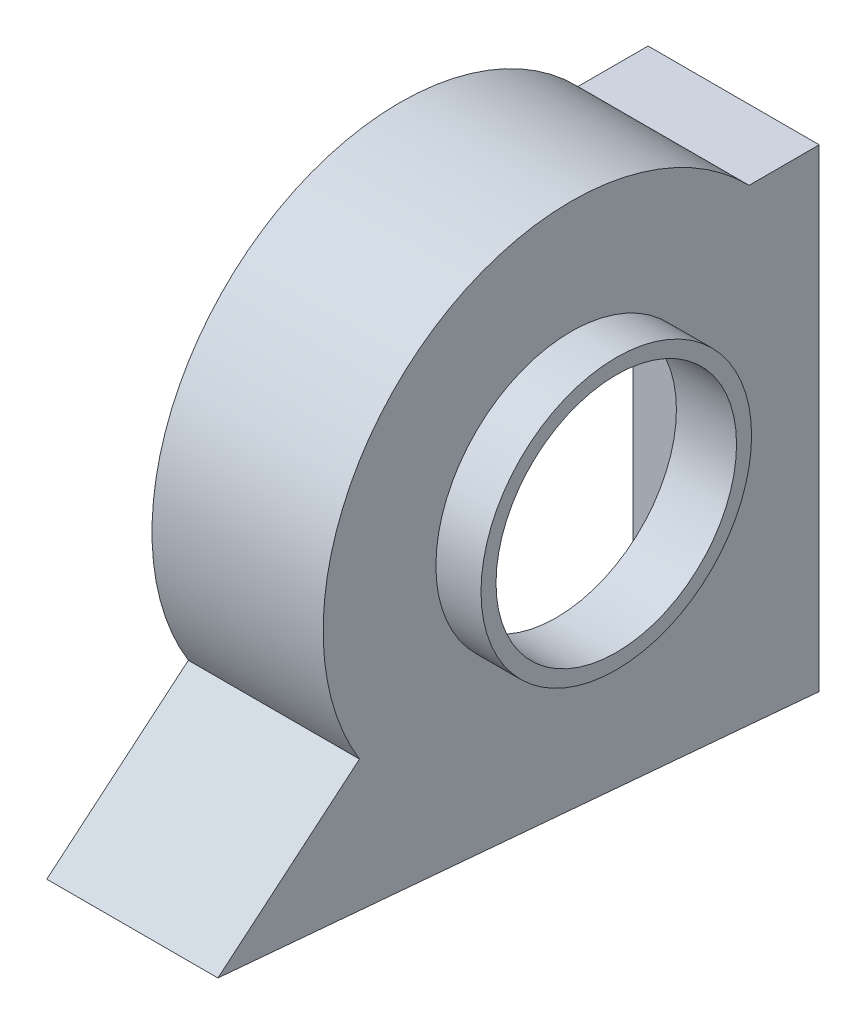
ISO-10303-21;
HEADER;
FILE_DESCRIPTION(('STEP AP214'),'2;1');
FILE_NAME('part.step','',(''),(''),'','','');
FILE_SCHEMA(('AUTOMOTIVE_DESIGN { 1 0 10303 214 1 1 1 1 }'));
ENDSEC;
DATA;
#1=APPLICATION_CONTEXT('core data for automotive mechanical design processes');
#2=APPLICATION_PROTOCOL_DEFINITION('international standard','automotive_design',2000,#1);
#3=PRODUCT_CONTEXT('',#1,'mechanical');
#4=PRODUCT('Part','Part','',(#3));
#5=PRODUCT_RELATED_PRODUCT_CATEGORY('part','',(#4));
#6=PRODUCT_DEFINITION_FORMATION('','',#4);
#7=PRODUCT_DEFINITION_CONTEXT('part definition',#1,'design');
#8=PRODUCT_DEFINITION('design','',#6,#7);
#9=PRODUCT_DEFINITION_SHAPE('','',#8);
#10=(LENGTH_UNIT() NAMED_UNIT(*) SI_UNIT(.MILLI.,.METRE.));
#11=(NAMED_UNIT(*) PLANE_ANGLE_UNIT() SI_UNIT($,.RADIAN.));
#12=(NAMED_UNIT(*) SI_UNIT($,.STERADIAN.) SOLID_ANGLE_UNIT());
#13=UNCERTAINTY_MEASURE_WITH_UNIT(LENGTH_MEASURE(1.E-05),#10,'distance_accuracy_value','');
#14=(GEOMETRIC_REPRESENTATION_CONTEXT(3) GLOBAL_UNCERTAINTY_ASSIGNED_CONTEXT((#13)) GLOBAL_UNIT_ASSIGNED_CONTEXT((#10,
#11,#12)) REPRESENTATION_CONTEXT('',''));
#15=CARTESIAN_POINT('',(0.,0.,0.));
#16=DIRECTION('',(0.,0.,1.));
#17=DIRECTION('',(1.,0.,0.));
#18=AXIS2_PLACEMENT_3D('',#15,#16,#17);
#19=CARTESIAN_POINT('',(-5.6925,35.,20.));
#20=DIRECTION('',(1.,0.,0.));
#21=DIRECTION('',(0.,0.,-1.));
#22=AXIS2_PLACEMENT_3D('',#19,#20,#21);
#23=PLANE('',#22);
#24=DIRECTION('',(0.,-1.,0.));
#25=VECTOR('',#24,1.);
#26=CARTESIAN_POINT('',(-5.6925,35.,-19.));
#27=LINE('',#26,#25);
#28=CARTESIAN_POINT('',(-5.6925,13.5,-19.));
#29=VERTEX_POINT('',#28);
#30=CARTESIAN_POINT('',(-5.6925,-2.40823803996742,-19.));
#31=VERTEX_POINT('',#30);
#32=EDGE_CURVE('E216',#29,#31,#27,.T.);
#33=ORIENTED_EDGE('',*,*,#32,.F.);
#34=DIRECTION('',(0.,0.,-1.));
#35=VECTOR('',#34,1.);
#36=CARTESIAN_POINT('',(-5.6925,13.5,-13.));
#37=LINE('',#36,#35);
#38=CARTESIAN_POINT('',(-5.6925,13.5,-20.));
#39=VERTEX_POINT('',#38);
#40=EDGE_CURVE('E54',#29,#39,#37,.T.);
#41=ORIENTED_EDGE('',*,*,#40,.T.);
#42=DIRECTION('',(0.,-1.,0.));
#43=VECTOR('',#42,1.);
#44=CARTESIAN_POINT('',(-5.6925,35.,-20.));
#45=LINE('',#44,#43);
#46=CARTESIAN_POINT('',(-5.6925,-3.49954654103668,-20.));
#47=VERTEX_POINT('',#46);
#48=EDGE_CURVE('E143',#39,#47,#45,.T.);
#49=ORIENTED_EDGE('',*,*,#48,.T.);
#50=DIRECTION('',(0.,0.0871557427476513,0.996194698091746));
#51=VECTOR('',#50,1.);
#52=CARTESIAN_POINT('',(-5.6925,0.,20.));
#53=LINE('',#52,#51);
#54=CARTESIAN_POINT('',(-5.6925,0.,20.));
#55=VERTEX_POINT('',#54);
#56=EDGE_CURVE('E231',#47,#55,#53,.T.);
#57=ORIENTED_EDGE('',*,*,#56,.T.);
#58=DIRECTION('',(0.,-0.642787609686538,0.766044443118979));
#59=VECTOR('',#58,1.);
#60=CARTESIAN_POINT('',(-5.6925,9.84807753012207,8.26351822333066));
#61=LINE('',#60,#59);
#62=CARTESIAN_POINT('',(-5.6925,7.90199647080288,10.5827673172539));
#63=VERTEX_POINT('',#62);
#64=EDGE_CURVE('E251',#63,#55,#61,.T.);
#65=ORIENTED_EDGE('',*,*,#64,.F.);
#66=CARTESIAN_POINT('',(-5.6925,16.5,-3.5));
#67=DIRECTION('',(1.,0.,0.));
#68=DIRECTION('',(0.,0.,-1.));
#69=AXIS2_PLACEMENT_3D('',#66,#67,#68);
#70=CIRCLE('',#69,16.5);
#71=CARTESIAN_POINT('',(-5.6925,28.,-15.3321595661992));
#72=VERTEX_POINT('',#71);
#73=EDGE_CURVE('E245',#72,#63,#70,.T.);
#74=ORIENTED_EDGE('',*,*,#73,.F.);
#75=DIRECTION('',(0.,0.,-1.));
#76=VECTOR('',#75,1.);
#77=CARTESIAN_POINT('',(-5.6925,28.,0.));
#78=LINE('',#77,#76);
#79=CARTESIAN_POINT('',(-5.6925,28.,-20.));
#80=VERTEX_POINT('',#79);
#81=EDGE_CURVE('E150',#72,#80,#78,.T.);
#82=ORIENTED_EDGE('',*,*,#81,.T.);
#83=CARTESIAN_POINT('',(-5.6925,19.5,-20.));
#84=VERTEX_POINT('',#83);
#85=EDGE_CURVE('E141',#80,#84,#45,.T.);
#86=ORIENTED_EDGE('',*,*,#85,.T.);
#87=DIRECTION('',(0.,0.,-1.));
#88=VECTOR('',#87,1.);
#89=CARTESIAN_POINT('',(-5.6925,19.5,-13.));
#90=LINE('',#89,#88);
#91=CARTESIAN_POINT('',(-5.6925,19.5,-19.));
#92=VERTEX_POINT('',#91);
#93=EDGE_CURVE('E126',#84,#92,#90,.F.);
#94=ORIENTED_EDGE('',*,*,#93,.T.);
#95=CARTESIAN_POINT('',(-5.6925,27.,-19.));
#96=VERTEX_POINT('',#95);
#97=EDGE_CURVE('E190',#96,#92,#27,.T.);
#98=ORIENTED_EDGE('',*,*,#97,.F.);
#99=DIRECTION('',(0.,0.,-1.));
#100=VECTOR('',#99,1.);
#101=CARTESIAN_POINT('',(-5.6925,27.,20.));
#102=LINE('',#101,#100);
#103=CARTESIAN_POINT('',(-5.6925,27.,-14.9017542509914));
#104=VERTEX_POINT('',#103);
#105=EDGE_CURVE('E225',#104,#96,#102,.T.);
#106=ORIENTED_EDGE('',*,*,#105,.F.);
#107=CARTESIAN_POINT('',(-5.6925,16.5,-3.5));
#108=DIRECTION('',(1.,0.,0.));
#109=DIRECTION('',(0.,0.,-1.));
#110=AXIS2_PLACEMENT_3D('',#107,#108,#109);
#111=CIRCLE('',#110,15.5);
#112=CARTESIAN_POINT('',(-5.6925,7.70429056918022,9.26266020892933));
#113=VERTEX_POINT('',#112);
#114=EDGE_CURVE('E62',#104,#113,#111,.T.);
#115=ORIENTED_EDGE('',*,*,#114,.T.);
#116=DIRECTION('',(0.,-0.642787609686538,0.766044443118979));
#117=VECTOR('',#116,1.);
#118=CARTESIAN_POINT('',(-5.6925,13.6951124477097,2.12307671259983));
#119=LINE('',#118,#117);
#120=CARTESIAN_POINT('',(-5.6925,0.785782121911663,17.5078175063551));
#121=VERTEX_POINT('',#120);
#122=EDGE_CURVE('E208',#113,#121,#119,.T.);
#123=ORIENTED_EDGE('',*,*,#122,.T.);
#124=DIRECTION('',(0.,0.0871557427476514,0.996194698091746));
#125=VECTOR('',#124,1.);
#126=CARTESIAN_POINT('',(-5.6925,1.26205902037806,22.9516873664234));
#127=LINE('',#126,#125);
#128=EDGE_CURVE('E172',#31,#121,#127,.T.);
#129=ORIENTED_EDGE('',*,*,#128,.F.);
#130=EDGE_LOOP('',(#33,#41,#49,#57,#65,#74,#82,#86,#94,#98,#106,#115,#123,#129));
#131=FACE_BOUND('',#130,.T.);
#132=ADVANCED_FACE('F39',(#131),#23,.F.);
#133=CARTESIAN_POINT('',(5.6925,35.,20.));
#134=DIRECTION('',(-1.,0.,0.));
#135=DIRECTION('',(0.,0.,1.));
#136=AXIS2_PLACEMENT_3D('',#133,#134,#135);
#137=PLANE('',#136);
#138=CARTESIAN_POINT('',(5.6925,16.5,-3.5));
#139=DIRECTION('',(-1.,0.,0.));
#140=DIRECTION('',(0.,0.,1.));
#141=AXIS2_PLACEMENT_3D('',#138,#139,#140);
#142=CIRCLE('',#141,9.00000000000001);
#143=CARTESIAN_POINT('',(5.6925,16.5,5.50000000000001));
#144=VERTEX_POINT('',#143);
#145=EDGE_CURVE('E48',#144,#144,#142,.F.);
#146=ORIENTED_EDGE('',*,*,#145,.F.);
#147=EDGE_LOOP('',(#146));
#148=FACE_BOUND('',#147,.T.);
#149=DIRECTION('',(0.,-0.642787609686538,0.766044443118979));
#150=VECTOR('',#149,1.);
#151=CARTESIAN_POINT('',(5.6925,9.84807753012207,8.26351822333066));
#152=LINE('',#151,#150);
#153=CARTESIAN_POINT('',(5.6925,7.90199647080288,10.5827673172539));
#154=VERTEX_POINT('',#153);
#155=CARTESIAN_POINT('',(5.6925,0.,20.));
#156=VERTEX_POINT('',#155);
#157=EDGE_CURVE('E248',#154,#156,#152,.T.);
#158=ORIENTED_EDGE('',*,*,#157,.T.);
#159=DIRECTION('',(0.,0.0871557427476513,0.996194698091746));
#160=VECTOR('',#159,1.);
#161=CARTESIAN_POINT('',(5.6925,0.,20.));
#162=LINE('',#161,#160);
#163=CARTESIAN_POINT('',(5.6925,-3.49954654103668,-20.));
#164=VERTEX_POINT('',#163);
#165=EDGE_CURVE('E180',#164,#156,#162,.T.);
#166=ORIENTED_EDGE('',*,*,#165,.F.);
#167=DIRECTION('',(0.,-1.,0.));
#168=VECTOR('',#167,1.);
#169=CARTESIAN_POINT('',(5.6925,35.,-20.));
#170=LINE('',#169,#168);
#171=CARTESIAN_POINT('',(5.6925,28.,-20.));
#172=VERTEX_POINT('',#171);
#173=EDGE_CURVE('E152',#172,#164,#170,.T.);
#174=ORIENTED_EDGE('',*,*,#173,.F.);
#175=DIRECTION('',(0.,0.,-1.));
#176=VECTOR('',#175,1.);
#177=CARTESIAN_POINT('',(5.6925,28.,0.));
#178=LINE('',#177,#176);
#179=CARTESIAN_POINT('',(5.6925,28.,-15.3321595661992));
#180=VERTEX_POINT('',#179);
#181=EDGE_CURVE('E259',#180,#172,#178,.T.);
#182=ORIENTED_EDGE('',*,*,#181,.F.);
#183=CARTESIAN_POINT('',(5.6925,16.5,-3.5));
#184=DIRECTION('',(1.,0.,0.));
#185=DIRECTION('',(0.,0.,-1.));
#186=AXIS2_PLACEMENT_3D('',#183,#184,#185);
#187=CIRCLE('',#186,16.5);
#188=EDGE_CURVE('E244',#180,#154,#187,.T.);
#189=ORIENTED_EDGE('',*,*,#188,.T.);
#190=EDGE_LOOP('',(#158,#166,#174,#182,#189));
#191=FACE_BOUND('',#190,.T.);
#192=ADVANCED_FACE('F41',(#148,#191),#137,.F.);
#193=CARTESIAN_POINT('',(-5.6925,35.,-20.));
#194=DIRECTION('',(0.,0.,1.));
#195=DIRECTION('',(1.,0.,0.));
#196=AXIS2_PLACEMENT_3D('',#193,#194,#195);
#197=PLANE('',#196);
#198=ORIENTED_EDGE('',*,*,#48,.F.);
#199=CARTESIAN_POINT('',(-5.6925,16.5,-20.));
#200=DIRECTION('',(0.,0.,-1.));
#201=DIRECTION('',(-1.,0.,0.));
#202=AXIS2_PLACEMENT_3D('',#199,#200,#201);
#203=CIRCLE('',#202,3.);
#204=EDGE_CURVE('E129',#84,#39,#203,.T.);
#205=ORIENTED_EDGE('',*,*,#204,.F.);
#206=ORIENTED_EDGE('',*,*,#85,.F.);
#207=DIRECTION('',(1.,0.,0.));
#208=VECTOR('',#207,1.);
#209=CARTESIAN_POINT('',(-5.6925,28.,-20.));
#210=LINE('',#209,#208);
#211=EDGE_CURVE('E269',#80,#172,#210,.T.);
#212=ORIENTED_EDGE('',*,*,#211,.T.);
#213=ORIENTED_EDGE('',*,*,#173,.T.);
#214=DIRECTION('',(1.,0.,0.));
#215=VECTOR('',#214,1.);
#216=CARTESIAN_POINT('',(-5.6925,-3.49954654103668,-20.));
#217=LINE('',#216,#215);
#218=EDGE_CURVE('E235',#47,#164,#217,.T.);
#219=ORIENTED_EDGE('',*,*,#218,.F.);
#220=EDGE_LOOP('',(#198,#205,#206,#212,#213,#219));
#221=FACE_BOUND('',#220,.T.);
#222=ADVANCED_FACE('F139',(#221),#197,.F.);
#223=CARTESIAN_POINT('',(-5.6925,16.5,-3.5));
#224=DIRECTION('',(1.,0.,0.));
#225=DIRECTION('',(0.,0.,-1.));
#226=AXIS2_PLACEMENT_3D('',#223,#224,#225);
#227=CYLINDRICAL_SURFACE('',#226,16.5);
#228=ORIENTED_EDGE('',*,*,#188,.F.);
#229=DIRECTION('',(1.,0.,0.));
#230=VECTOR('',#229,1.);
#231=CARTESIAN_POINT('',(-5.6925,28.,-15.3321595661992));
#232=LINE('',#231,#230);
#233=EDGE_CURVE('E255',#72,#180,#232,.T.);
#234=ORIENTED_EDGE('',*,*,#233,.F.);
#235=ORIENTED_EDGE('',*,*,#73,.T.);
#236=DIRECTION('',(1.,0.,0.));
#237=VECTOR('',#236,1.);
#238=CARTESIAN_POINT('',(-5.6925,7.90199647080288,10.5827673172539));
#239=LINE('',#238,#237);
#240=EDGE_CURVE('E265',#63,#154,#239,.T.);
#241=ORIENTED_EDGE('',*,*,#240,.T.);
#242=EDGE_LOOP('',(#228,#234,#235,#241));
#243=FACE_BOUND('',#242,.T.);
#244=ADVANCED_FACE('F277',(#243),#227,.T.);
#245=CARTESIAN_POINT('',(-5.6925,9.84807753012207,8.26351822333066));
#246=DIRECTION('',(0.,0.766044443118979,0.642787609686538));
#247=DIRECTION('',(0.,-0.642787609686538,0.766044443118979));
#248=AXIS2_PLACEMENT_3D('',#245,#246,#247);
#249=PLANE('',#248);
#250=ORIENTED_EDGE('',*,*,#157,.F.);
#251=ORIENTED_EDGE('',*,*,#240,.F.);
#252=ORIENTED_EDGE('',*,*,#64,.T.);
#253=DIRECTION('',(1.,0.,0.));
#254=VECTOR('',#253,1.);
#255=CARTESIAN_POINT('',(-5.6925,0.,20.));
#256=LINE('',#255,#254);
#257=EDGE_CURVE('E158',#55,#156,#256,.T.);
#258=ORIENTED_EDGE('',*,*,#257,.T.);
#259=EDGE_LOOP('',(#250,#251,#252,#258));
#260=FACE_BOUND('',#259,.T.);
#261=ADVANCED_FACE('F288',(#260),#249,.T.);
#262=CARTESIAN_POINT('',(-5.6925,28.,0.));
#263=DIRECTION('',(0.,-1.,0.));
#264=DIRECTION('',(0.,0.,-1.));
#265=AXIS2_PLACEMENT_3D('',#262,#263,#264);
#266=PLANE('',#265);
#267=ORIENTED_EDGE('',*,*,#181,.T.);
#268=ORIENTED_EDGE('',*,*,#211,.F.);
#269=ORIENTED_EDGE('',*,*,#81,.F.);
#270=ORIENTED_EDGE('',*,*,#233,.T.);
#271=EDGE_LOOP('',(#267,#268,#269,#270));
#272=FACE_BOUND('',#271,.T.);
#273=ADVANCED_FACE('F274',(#272),#266,.F.);
#274=CARTESIAN_POINT('',(8.6925,16.5,-3.5));
#275=DIRECTION('',(-1.,0.,0.));
#276=DIRECTION('',(0.,0.,1.));
#277=AXIS2_PLACEMENT_3D('',#274,#275,#276);
#278=CYLINDRICAL_SURFACE('',#277,9.00000000000001);
#279=CARTESIAN_POINT('',(8.6925,16.5,-3.5));
#280=DIRECTION('',(1.,0.,0.));
#281=DIRECTION('',(0.,0.,-1.));
#282=AXIS2_PLACEMENT_3D('',#279,#280,#281);
#283=CIRCLE('',#282,9.00000000000001);
#284=CARTESIAN_POINT('',(8.6925,16.5,-12.5));
#285=VERTEX_POINT('',#284);
#286=EDGE_CURVE('E240',#285,#285,#283,.T.);
#287=ORIENTED_EDGE('',*,*,#286,.F.);
#288=EDGE_LOOP('',(#287));
#289=FACE_BOUND('',#288,.T.);
#290=ORIENTED_EDGE('',*,*,#145,.T.);
#291=EDGE_LOOP('',(#290));
#292=FACE_BOUND('',#291,.T.);
#293=ADVANCED_FACE('F296',(#289,#292),#278,.T.);
#294=CARTESIAN_POINT('',(8.6925,16.5,-3.5));
#295=DIRECTION('',(1.,0.,0.));
#296=DIRECTION('',(0.,0.,-1.));
#297=AXIS2_PLACEMENT_3D('',#294,#295,#296);
#298=PLANE('',#297);
#299=CARTESIAN_POINT('',(8.6925,16.5,-3.5));
#300=DIRECTION('',(1.,0.,0.));
#301=DIRECTION('',(0.,0.,-1.));
#302=AXIS2_PLACEMENT_3D('',#299,#300,#301);
#303=CIRCLE('',#302,8.);
#304=CARTESIAN_POINT('',(8.6925,16.5,-11.5));
#305=VERTEX_POINT('',#304);
#306=EDGE_CURVE('E164',#305,#305,#303,.T.);
#307=ORIENTED_EDGE('',*,*,#306,.F.);
#308=EDGE_LOOP('',(#307));
#309=FACE_BOUND('',#308,.T.);
#310=ORIENTED_EDGE('',*,*,#286,.T.);
#311=EDGE_LOOP('',(#310));
#312=FACE_BOUND('',#311,.T.);
#313=ADVANCED_FACE('F332',(#309,#312),#298,.T.);
#314=CARTESIAN_POINT('',(-5.6925,0.,20.));
#315=DIRECTION('',(0.,0.996194698091746,-0.0871557427476514));
#316=DIRECTION('',(0.,0.0871557427476514,0.996194698091746));
#317=AXIS2_PLACEMENT_3D('',#314,#315,#316);
#318=PLANE('',#317);
#319=ORIENTED_EDGE('',*,*,#165,.T.);
#320=ORIENTED_EDGE('',*,*,#257,.F.);
#321=ORIENTED_EDGE('',*,*,#56,.F.);
#322=ORIENTED_EDGE('',*,*,#218,.T.);
#323=EDGE_LOOP('',(#319,#320,#321,#322));
#324=FACE_BOUND('',#323,.T.);
#325=ADVANCED_FACE('F284',(#324),#318,.F.);
#326=CARTESIAN_POINT('',(4.6925,35.,20.));
#327=DIRECTION('',(-1.,0.,0.));
#328=DIRECTION('',(0.,0.,1.));
#329=AXIS2_PLACEMENT_3D('',#326,#327,#328);
#330=PLANE('',#329);
#331=CARTESIAN_POINT('',(4.6925,16.5,-3.5));
#332=DIRECTION('',(-1.,0.,0.));
#333=DIRECTION('',(0.,0.,1.));
#334=AXIS2_PLACEMENT_3D('',#331,#332,#333);
#335=CIRCLE('',#334,8.);
#336=CARTESIAN_POINT('',(4.6925,16.5,4.5));
#337=VERTEX_POINT('',#336);
#338=EDGE_CURVE('E176',#337,#337,#335,.F.);
#339=ORIENTED_EDGE('',*,*,#338,.T.);
#340=EDGE_LOOP('',(#339));
#341=FACE_BOUND('',#340,.T.);
#342=DIRECTION('',(0.,-0.642787609686538,0.766044443118979));
#343=VECTOR('',#342,1.);
#344=CARTESIAN_POINT('',(4.6925,9.0820330870031,7.62073061364412));
#345=LINE('',#344,#343);
#346=CARTESIAN_POINT('',(4.6925,7.70429056918022,9.26266020892933));
#347=VERTEX_POINT('',#346);
#348=CARTESIAN_POINT('',(4.6925,0.785782121911663,17.5078175063551));
#349=VERTEX_POINT('',#348);
#350=EDGE_CURVE('E182',#347,#349,#345,.T.);
#351=ORIENTED_EDGE('',*,*,#350,.F.);
#352=CARTESIAN_POINT('',(4.6925,16.5,-3.5));
#353=DIRECTION('',(-1.,0.,0.));
#354=DIRECTION('',(0.,0.,1.));
#355=AXIS2_PLACEMENT_3D('',#352,#353,#354);
#356=CIRCLE('',#355,15.5);
#357=CARTESIAN_POINT('',(4.6925,27.,-14.9017542509914));
#358=VERTEX_POINT('',#357);
#359=EDGE_CURVE('E193',#358,#347,#356,.F.);
#360=ORIENTED_EDGE('',*,*,#359,.F.);
#361=DIRECTION('',(0.,0.,-1.));
#362=VECTOR('',#361,1.);
#363=CARTESIAN_POINT('',(4.6925,27.,0.));
#364=LINE('',#363,#362);
#365=CARTESIAN_POINT('',(4.6925,27.,-19.));
#366=VERTEX_POINT('',#365);
#367=EDGE_CURVE('E185',#358,#366,#364,.T.);
#368=ORIENTED_EDGE('',*,*,#367,.T.);
#369=DIRECTION('',(0.,-1.,0.));
#370=VECTOR('',#369,1.);
#371=CARTESIAN_POINT('',(4.6925,35.,-19.));
#372=LINE('',#371,#370);
#373=CARTESIAN_POINT('',(4.6925,-2.40823803996742,-19.));
#374=VERTEX_POINT('',#373);
#375=EDGE_CURVE('E181',#366,#374,#372,.T.);
#376=ORIENTED_EDGE('',*,*,#375,.T.);
#377=DIRECTION('',(0.,0.0871557427476514,0.996194698091746));
#378=VECTOR('',#377,1.);
#379=CARTESIAN_POINT('',(4.6925,0.996194698091746,19.9128442572523));
#380=LINE('',#379,#378);
#381=EDGE_CURVE('E167',#374,#349,#380,.T.);
#382=ORIENTED_EDGE('',*,*,#381,.T.);
#383=EDGE_LOOP('',(#351,#360,#368,#376,#382));
#384=FACE_BOUND('',#383,.T.);
#385=ADVANCED_FACE('F351',(#341,#384),#330,.T.);
#386=CARTESIAN_POINT('',(-5.6925,35.,-19.));
#387=DIRECTION('',(0.,0.,1.));
#388=DIRECTION('',(1.,0.,0.));
#389=AXIS2_PLACEMENT_3D('',#386,#387,#388);
#390=PLANE('',#389);
#391=CARTESIAN_POINT('',(-5.6925,16.5,-19.));
#392=DIRECTION('',(0.,0.,1.));
#393=DIRECTION('',(1.,0.,0.));
#394=AXIS2_PLACEMENT_3D('',#391,#392,#393);
#395=CIRCLE('',#394,3.);
#396=EDGE_CURVE('E11',#29,#92,#395,.T.);
#397=ORIENTED_EDGE('',*,*,#396,.F.);
#398=ORIENTED_EDGE('',*,*,#32,.T.);
#399=DIRECTION('',(1.,0.,0.));
#400=VECTOR('',#399,1.);
#401=CARTESIAN_POINT('',(-5.6925,-2.40823803996742,-19.));
#402=LINE('',#401,#400);
#403=EDGE_CURVE('E197',#31,#374,#402,.T.);
#404=ORIENTED_EDGE('',*,*,#403,.T.);
#405=ORIENTED_EDGE('',*,*,#375,.F.);
#406=DIRECTION('',(1.,0.,0.));
#407=VECTOR('',#406,1.);
#408=CARTESIAN_POINT('',(-5.6925,27.,-19.));
#409=LINE('',#408,#407);
#410=EDGE_CURVE('E200',#96,#366,#409,.T.);
#411=ORIENTED_EDGE('',*,*,#410,.F.);
#412=ORIENTED_EDGE('',*,*,#97,.T.);
#413=EDGE_LOOP('',(#397,#398,#404,#405,#411,#412));
#414=FACE_BOUND('',#413,.T.);
#415=ADVANCED_FACE('F361',(#414),#390,.T.);
#416=CARTESIAN_POINT('',(-5.6925,16.5,-3.5));
#417=DIRECTION('',(1.,0.,0.));
#418=DIRECTION('',(0.,0.,-1.));
#419=AXIS2_PLACEMENT_3D('',#416,#417,#418);
#420=CYLINDRICAL_SURFACE('',#419,15.5);
#421=ORIENTED_EDGE('',*,*,#359,.T.);
#422=DIRECTION('',(1.,0.,0.));
#423=VECTOR('',#422,1.);
#424=CARTESIAN_POINT('',(-5.6925,7.70429056918022,9.26266020892933));
#425=LINE('',#424,#423);
#426=EDGE_CURVE('E204',#113,#347,#425,.T.);
#427=ORIENTED_EDGE('',*,*,#426,.F.);
#428=ORIENTED_EDGE('',*,*,#114,.F.);
#429=DIRECTION('',(1.,0.,0.));
#430=VECTOR('',#429,1.);
#431=CARTESIAN_POINT('',(-5.6925,27.,-14.9017542509914));
#432=LINE('',#431,#430);
#433=EDGE_CURVE('E205',#104,#358,#432,.T.);
#434=ORIENTED_EDGE('',*,*,#433,.T.);
#435=EDGE_LOOP('',(#421,#427,#428,#434));
#436=FACE_BOUND('',#435,.T.);
#437=ADVANCED_FACE('F370',(#436),#420,.F.);
#438=CARTESIAN_POINT('',(-5.6925,9.0820330870031,7.62073061364412));
#439=DIRECTION('',(0.,0.766044443118979,0.642787609686538));
#440=DIRECTION('',(0.,-0.642787609686538,0.766044443118979));
#441=AXIS2_PLACEMENT_3D('',#438,#439,#440);
#442=PLANE('',#441);
#443=ORIENTED_EDGE('',*,*,#350,.T.);
#444=DIRECTION('',(1.,0.,0.));
#445=VECTOR('',#444,1.);
#446=CARTESIAN_POINT('',(-5.6925,0.785782121911663,17.5078175063551));
#447=LINE('',#446,#445);
#448=EDGE_CURVE('E212',#121,#349,#447,.T.);
#449=ORIENTED_EDGE('',*,*,#448,.F.);
#450=ORIENTED_EDGE('',*,*,#122,.F.);
#451=ORIENTED_EDGE('',*,*,#426,.T.);
#452=EDGE_LOOP('',(#443,#449,#450,#451));
#453=FACE_BOUND('',#452,.T.);
#454=ADVANCED_FACE('F375',(#453),#442,.F.);
#455=CARTESIAN_POINT('',(-5.6925,27.,0.));
#456=DIRECTION('',(0.,-1.,0.));
#457=DIRECTION('',(0.,0.,-1.));
#458=AXIS2_PLACEMENT_3D('',#455,#456,#457);
#459=PLANE('',#458);
#460=ORIENTED_EDGE('',*,*,#367,.F.);
#461=ORIENTED_EDGE('',*,*,#433,.F.);
#462=ORIENTED_EDGE('',*,*,#105,.T.);
#463=ORIENTED_EDGE('',*,*,#410,.T.);
#464=EDGE_LOOP('',(#460,#461,#462,#463));
#465=FACE_BOUND('',#464,.T.);
#466=ADVANCED_FACE('F385',(#465),#459,.T.);
#467=CARTESIAN_POINT('',(8.6925,16.5,-3.5));
#468=DIRECTION('',(-1.,0.,0.));
#469=DIRECTION('',(0.,0.,1.));
#470=AXIS2_PLACEMENT_3D('',#467,#468,#469);
#471=CYLINDRICAL_SURFACE('',#470,8.);
#472=ORIENTED_EDGE('',*,*,#338,.F.);
#473=EDGE_LOOP('',(#472));
#474=FACE_BOUND('',#473,.T.);
#475=ORIENTED_EDGE('',*,*,#306,.T.);
#476=EDGE_LOOP('',(#475));
#477=FACE_BOUND('',#476,.T.);
#478=ADVANCED_FACE('F395',(#474,#477),#471,.F.);
#479=CARTESIAN_POINT('',(-5.6925,0.996194698091746,19.9128442572523));
#480=DIRECTION('',(0.,0.996194698091746,-0.0871557427476514));
#481=DIRECTION('',(0.,0.0871557427476514,0.996194698091746));
#482=AXIS2_PLACEMENT_3D('',#479,#480,#481);
#483=PLANE('',#482);
#484=ORIENTED_EDGE('',*,*,#381,.F.);
#485=ORIENTED_EDGE('',*,*,#403,.F.);
#486=ORIENTED_EDGE('',*,*,#128,.T.);
#487=ORIENTED_EDGE('',*,*,#448,.T.);
#488=EDGE_LOOP('',(#484,#485,#486,#487));
#489=FACE_BOUND('',#488,.T.);
#490=ADVANCED_FACE('F403',(#489),#483,.T.);
#491=CARTESIAN_POINT('',(-5.6925,16.5,-13.));
#492=DIRECTION('',(0.,0.,-1.));
#493=DIRECTION('',(-1.,0.,0.));
#494=AXIS2_PLACEMENT_3D('',#491,#492,#493);
#495=CYLINDRICAL_SURFACE('',#494,3.);
#496=ORIENTED_EDGE('',*,*,#396,.T.);
#497=ORIENTED_EDGE('',*,*,#93,.F.);
#498=ORIENTED_EDGE('',*,*,#204,.T.);
#499=ORIENTED_EDGE('',*,*,#40,.F.);
#500=EDGE_LOOP('',(#496,#497,#498,#499));
#501=FACE_BOUND('',#500,.T.);
#502=ADVANCED_FACE('F128',(#501),#495,.F.);
#503=CLOSED_SHELL('',(#132,#192,#222,#244,#261,#273,#293,#313,#325,#385,#415,#437,#454,#466,
#478,#490,#502));
#504=MANIFOLD_SOLID_BREP('B2',#503);
#505=ADVANCED_BREP_SHAPE_REPRESENTATION('',(#18,#504),#14);
#506=SHAPE_DEFINITION_REPRESENTATION(#9,#505);
ENDSEC;
END-ISO-10303-21;
